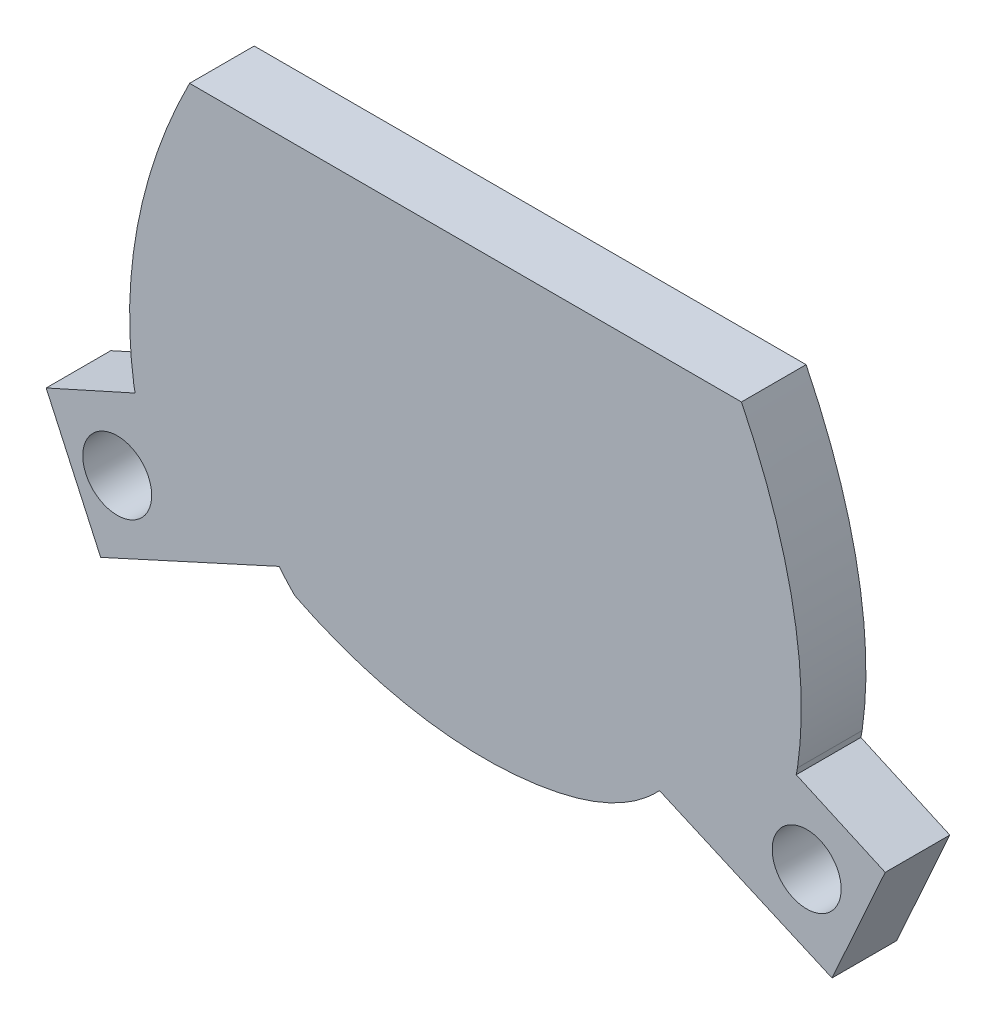
ISO-10303-21;
HEADER;
FILE_DESCRIPTION(('STEP AP214'),'2;1');
FILE_NAME('part.step','',(''),(''),'','','');
FILE_SCHEMA(('AUTOMOTIVE_DESIGN { 1 0 10303 214 1 1 1 1 }'));
ENDSEC;
DATA;
#1=APPLICATION_CONTEXT('core data for automotive mechanical design processes');
#2=APPLICATION_PROTOCOL_DEFINITION('international standard','automotive_design',2000,#1);
#3=PRODUCT_CONTEXT('',#1,'mechanical');
#4=PRODUCT('Part','Part','',(#3));
#5=PRODUCT_RELATED_PRODUCT_CATEGORY('part','',(#4));
#6=PRODUCT_DEFINITION_FORMATION('','',#4);
#7=PRODUCT_DEFINITION_CONTEXT('part definition',#1,'design');
#8=PRODUCT_DEFINITION('design','',#6,#7);
#9=PRODUCT_DEFINITION_SHAPE('','',#8);
#10=(LENGTH_UNIT() NAMED_UNIT(*) SI_UNIT(.MILLI.,.METRE.));
#11=(NAMED_UNIT(*) PLANE_ANGLE_UNIT() SI_UNIT($,.RADIAN.));
#12=(NAMED_UNIT(*) SI_UNIT($,.STERADIAN.) SOLID_ANGLE_UNIT());
#13=UNCERTAINTY_MEASURE_WITH_UNIT(LENGTH_MEASURE(1.E-05),#10,'distance_accuracy_value','');
#14=(GEOMETRIC_REPRESENTATION_CONTEXT(3) GLOBAL_UNCERTAINTY_ASSIGNED_CONTEXT((#13)) GLOBAL_UNIT_ASSIGNED_CONTEXT((#10,
#11,#12)) REPRESENTATION_CONTEXT('',''));
#15=CARTESIAN_POINT('',(0.,0.,0.));
#16=DIRECTION('',(0.,0.,1.));
#17=DIRECTION('',(1.,0.,0.));
#18=AXIS2_PLACEMENT_3D('',#15,#16,#17);
#19=CARTESIAN_POINT('',(-3.97195936555267,-4.01207544096857,-3.5));
#20=CARTESIAN_POINT('',(-2.25305588571177,-4.87339808105947,-3.5));
#21=CARTESIAN_POINT('',(0.818181256328631,-5.49697015504955,-3.5));
#22=CARTESIAN_POINT('',(3.75140915185491,-4.48949841015248,-3.5));
#23=CARTESIAN_POINT('',(4.49416265815548,-3.69907752659593,-3.5));
#24=B_SPLINE_CURVE_WITH_KNOTS('',3,(#19,#20,#21,#22,#23),.UNSPECIFIED.,.F.,.F.,(4,1,4),(0.,
0.646098760174716,1.),.UNSPECIFIED.);
#25=DIRECTION('',(0.,0.,1.));
#26=VECTOR('',#25,1.);
#27=SURFACE_OF_LINEAR_EXTRUSION('',#24,#26);
#28=CARTESIAN_POINT('',(-3.97195936555267,-4.01207544096857,-2.));
#29=CARTESIAN_POINT('',(-2.25305588571177,-4.87339808105947,-2.));
#30=CARTESIAN_POINT('',(0.818181256328631,-5.49697015504955,-2.));
#31=CARTESIAN_POINT('',(3.75140915185491,-4.48949841015248,-2.));
#32=CARTESIAN_POINT('',(4.49416265815548,-3.69907752659593,-2.));
#33=B_SPLINE_CURVE_WITH_KNOTS('',3,(#28,#29,#30,#31,#32),.UNSPECIFIED.,.F.,.F.,(4,1,4),(0.,
0.646098760174716,1.),.UNSPECIFIED.);
#34=CARTESIAN_POINT('',(-3.97195936555267,-4.01207544096857,-2.));
#35=VERTEX_POINT('',#34);
#36=CARTESIAN_POINT('',(4.49416265815548,-3.69907752659593,-2.));
#37=VERTEX_POINT('',#36);
#38=EDGE_CURVE('E163',#35,#37,#33,.T.);
#39=ORIENTED_EDGE('',*,*,#38,.F.);
#40=DIRECTION('',(0.,0.,1.));
#41=VECTOR('',#40,1.);
#42=CARTESIAN_POINT('',(-3.97195936555267,-4.01207544096857,-3.5));
#43=LINE('',#42,#41);
#44=CARTESIAN_POINT('',(-3.97195936555267,-4.01207544096857,-3.5));
#45=VERTEX_POINT('',#44);
#46=EDGE_CURVE('E11',#45,#35,#43,.T.);
#47=ORIENTED_EDGE('',*,*,#46,.F.);
#48=CARTESIAN_POINT('',(4.49416265815548,-3.69907752659593,-3.5));
#49=VERTEX_POINT('',#48);
#50=EDGE_CURVE('E243',#45,#49,#24,.T.);
#51=ORIENTED_EDGE('',*,*,#50,.T.);
#52=DIRECTION('',(0.,0.,1.));
#53=VECTOR('',#52,1.);
#54=CARTESIAN_POINT('',(4.49416265815548,-3.69907752659593,-3.5));
#55=LINE('',#54,#53);
#56=EDGE_CURVE('E36',#49,#37,#55,.T.);
#57=ORIENTED_EDGE('',*,*,#56,.T.);
#58=EDGE_LOOP('',(#39,#47,#51,#57));
#59=FACE_BOUND('',#58,.T.);
#60=ADVANCED_FACE('F32',(#59),#27,.T.);
#61=CARTESIAN_POINT('',(-4.33462623295867,-3.60616381402592,-3.5));
#62=CARTESIAN_POINT('',(-4.22005915438048,-3.74689398391151,-3.5));
#63=CARTESIAN_POINT('',(-4.09891169583794,-3.88232338201614,-3.5));
#64=CARTESIAN_POINT('',(-3.97195936555267,-4.01207544096857,-3.5));
#65=B_SPLINE_CURVE_WITH_KNOTS('',3,(#61,#62,#63,#64),.UNSPECIFIED.,.F.,.F.,(4,4),(0.,
0.126750823056757),.UNSPECIFIED.);
#66=DIRECTION('',(0.,0.,1.));
#67=VECTOR('',#66,1.);
#68=SURFACE_OF_LINEAR_EXTRUSION('',#65,#67);
#69=CARTESIAN_POINT('',(-4.33462623295867,-3.60616381402592,-2.));
#70=CARTESIAN_POINT('',(-4.22005915438048,-3.74689398391151,-2.));
#71=CARTESIAN_POINT('',(-4.09891169583794,-3.88232338201614,-2.));
#72=CARTESIAN_POINT('',(-3.97195936555267,-4.01207544096857,-2.));
#73=B_SPLINE_CURVE_WITH_KNOTS('',3,(#69,#70,#71,#72),.UNSPECIFIED.,.F.,.F.,(4,4),(0.,
0.126750823056757),.UNSPECIFIED.);
#74=CARTESIAN_POINT('',(-4.33462623295867,-3.60616381402592,-2.));
#75=VERTEX_POINT('',#74);
#76=EDGE_CURVE('E250',#75,#35,#73,.T.);
#77=ORIENTED_EDGE('',*,*,#76,.F.);
#78=DIRECTION('',(0.,0.,1.));
#79=VECTOR('',#78,1.);
#80=CARTESIAN_POINT('',(-4.33462623295867,-3.60616381402592,-3.5));
#81=LINE('',#80,#79);
#82=CARTESIAN_POINT('',(-4.33462623295867,-3.60616381402592,-3.5));
#83=VERTEX_POINT('',#82);
#84=EDGE_CURVE('E42',#83,#75,#81,.T.);
#85=ORIENTED_EDGE('',*,*,#84,.F.);
#86=EDGE_CURVE('E150',#83,#45,#65,.T.);
#87=ORIENTED_EDGE('',*,*,#86,.T.);
#88=ORIENTED_EDGE('',*,*,#46,.T.);
#89=EDGE_LOOP('',(#77,#85,#87,#88));
#90=FACE_BOUND('',#89,.T.);
#91=ADVANCED_FACE('F171',(#90),#68,.T.);
#92=CARTESIAN_POINT('',(-8.47618977931289,-5.49536875469433,-3.5));
#93=DIRECTION('',(0.415018034668083,-0.909813184615524,0.));
#94=DIRECTION('',(0.909813184615524,0.415018034668083,0.));
#95=AXIS2_PLACEMENT_3D('',#92,#93,#94);
#96=PLANE('',#95);
#97=DIRECTION('',(0.909813184615524,0.415018034668083,0.));
#98=VECTOR('',#97,1.);
#99=CARTESIAN_POINT('',(-8.47618977931289,-5.49536875469433,-2.));
#100=LINE('',#99,#98);
#101=CARTESIAN_POINT('',(-8.47618977931289,-5.49536875469433,-2.));
#102=VERTEX_POINT('',#101);
#103=EDGE_CURVE('E137',#102,#75,#100,.T.);
#104=ORIENTED_EDGE('',*,*,#103,.F.);
#105=DIRECTION('',(0.,0.,1.));
#106=VECTOR('',#105,1.);
#107=CARTESIAN_POINT('',(-8.47618977931289,-5.49536875469433,-3.5));
#108=LINE('',#107,#106);
#109=CARTESIAN_POINT('',(-8.47618977931289,-5.49536875469433,-3.5));
#110=VERTEX_POINT('',#109);
#111=EDGE_CURVE('E132',#110,#102,#108,.T.);
#112=ORIENTED_EDGE('',*,*,#111,.F.);
#113=DIRECTION('',(0.909813184615524,0.415018034668083,0.));
#114=VECTOR('',#113,1.);
#115=CARTESIAN_POINT('',(-8.47618977931289,-5.49536875469433,-3.5));
#116=LINE('',#115,#114);
#117=EDGE_CURVE('E135',#110,#83,#116,.T.);
#118=ORIENTED_EDGE('',*,*,#117,.T.);
#119=ORIENTED_EDGE('',*,*,#84,.T.);
#120=EDGE_LOOP('',(#104,#112,#118,#119));
#121=FACE_BOUND('',#120,.T.);
#122=ADVANCED_FACE('F134',(#121),#96,.T.);
#123=CARTESIAN_POINT('',(-9.74091143753534,-2.7228134838376,-3.5));
#124=DIRECTION('',(-0.909813184615524,-0.415018034668083,0.));
#125=DIRECTION('',(0.415018034668083,-0.909813184615524,0.));
#126=AXIS2_PLACEMENT_3D('',#123,#124,#125);
#127=PLANE('',#126);
#128=DIRECTION('',(0.415018034668083,-0.909813184615524,0.));
#129=VECTOR('',#128,1.);
#130=CARTESIAN_POINT('',(-9.74091143753534,-2.7228134838376,-2.));
#131=LINE('',#130,#129);
#132=CARTESIAN_POINT('',(-9.74091143753534,-2.7228134838376,-2.));
#133=VERTEX_POINT('',#132);
#134=EDGE_CURVE('E471',#133,#102,#131,.T.);
#135=ORIENTED_EDGE('',*,*,#134,.F.);
#136=DIRECTION('',(0.,0.,1.));
#137=VECTOR('',#136,1.);
#138=CARTESIAN_POINT('',(-9.74091143753534,-2.7228134838376,-3.5));
#139=LINE('',#138,#137);
#140=CARTESIAN_POINT('',(-9.74091143753534,-2.7228134838376,-3.5));
#141=VERTEX_POINT('',#140);
#142=EDGE_CURVE('E142',#141,#133,#139,.T.);
#143=ORIENTED_EDGE('',*,*,#142,.F.);
#144=DIRECTION('',(0.415018034668083,-0.909813184615524,0.));
#145=VECTOR('',#144,1.);
#146=CARTESIAN_POINT('',(-9.74091143753534,-2.7228134838376,-3.5));
#147=LINE('',#146,#145);
#148=EDGE_CURVE('E148',#141,#110,#147,.T.);
#149=ORIENTED_EDGE('',*,*,#148,.T.);
#150=ORIENTED_EDGE('',*,*,#111,.T.);
#151=EDGE_LOOP('',(#135,#143,#149,#150));
#152=FACE_BOUND('',#151,.T.);
#153=ADVANCED_FACE('F152',(#152),#127,.T.);
#154=CARTESIAN_POINT('',(-9.74091143753534,-2.7228134838376,-3.5));
#155=DIRECTION('',(-0.410622749483671,0.911805328788152,0.));
#156=DIRECTION('',(-0.911805328788153,-0.410622749483671,0.));
#157=AXIS2_PLACEMENT_3D('',#154,#155,#156);
#158=PLANE('',#157);
#159=DIRECTION('',(-0.911805328788152,-0.410622749483671,0.));
#160=VECTOR('',#159,1.);
#161=CARTESIAN_POINT('',(-9.74091143753534,-2.7228134838376,-2.));
#162=LINE('',#161,#160);
#163=CARTESIAN_POINT('',(-7.67624344077141,-1.79301013345696,-2.));
#164=VERTEX_POINT('',#163);
#165=EDGE_CURVE('E465',#164,#133,#162,.T.);
#166=ORIENTED_EDGE('',*,*,#165,.F.);
#167=DIRECTION('',(0.,0.,1.));
#168=VECTOR('',#167,1.);
#169=CARTESIAN_POINT('',(-7.67624344077141,-1.79301013345696,-3.5));
#170=LINE('',#169,#168);
#171=CARTESIAN_POINT('',(-7.67624344077141,-1.79301013345696,-3.5));
#172=VERTEX_POINT('',#171);
#173=EDGE_CURVE('E215',#172,#164,#170,.T.);
#174=ORIENTED_EDGE('',*,*,#173,.F.);
#175=DIRECTION('',(-0.911805328788152,-0.410622749483671,0.));
#176=VECTOR('',#175,1.);
#177=CARTESIAN_POINT('',(-9.74091143753534,-2.7228134838376,-3.5));
#178=LINE('',#177,#176);
#179=EDGE_CURVE('E153',#172,#141,#178,.T.);
#180=ORIENTED_EDGE('',*,*,#179,.T.);
#181=ORIENTED_EDGE('',*,*,#142,.T.);
#182=EDGE_LOOP('',(#166,#174,#180,#181));
#183=FACE_BOUND('',#182,.T.);
#184=ADVANCED_FACE('F181',(#183),#158,.T.);
#185=CARTESIAN_POINT('',(-7.70604499898786,-1.64003975939678,-3.5));
#186=DIRECTION('',(-0.981546416214704,-0.191224038279895,0.));
#187=DIRECTION('',(0.191224038279896,-0.981546416214704,0.));
#188=AXIS2_PLACEMENT_3D('',#185,#186,#187);
#189=PLANE('',#188);
#190=CARTESIAN_POINT('',(-7.70604499898786,-1.64003975939678,-2.));
#191=CARTESIAN_POINT('',(-7.67624344077141,-1.79301013345696,-2.));
#192=B_SPLINE_CURVE_WITH_KNOTS('',1,(#190,#191),.UNSPECIFIED.,.F.,.F.,(2,2),(0.,1.),.UNSPECIFIED.);
#193=CARTESIAN_POINT('',(-7.70604499898786,-1.64003975939678,-2.));
#194=VERTEX_POINT('',#193);
#195=EDGE_CURVE('E457',#194,#164,#192,.T.);
#196=ORIENTED_EDGE('',*,*,#195,.F.);
#197=DIRECTION('',(0.,0.,1.));
#198=VECTOR('',#197,1.);
#199=CARTESIAN_POINT('',(-7.70604499898786,-1.64003975939678,-3.5));
#200=LINE('',#199,#198);
#201=CARTESIAN_POINT('',(-7.70604499898786,-1.64003975939678,-3.5));
#202=VERTEX_POINT('',#201);
#203=EDGE_CURVE('E217',#202,#194,#200,.T.);
#204=ORIENTED_EDGE('',*,*,#203,.F.);
#205=CARTESIAN_POINT('',(-7.70604499898786,-1.64003975939678,-3.5));
#206=CARTESIAN_POINT('',(-7.67624344077141,-1.79301013345696,-3.5));
#207=B_SPLINE_CURVE_WITH_KNOTS('',1,(#205,#206),.UNSPECIFIED.,.F.,.F.,(2,2),(0.,1.),.UNSPECIFIED.);
#208=EDGE_CURVE('E155',#202,#172,#207,.T.);
#209=ORIENTED_EDGE('',*,*,#208,.T.);
#210=ORIENTED_EDGE('',*,*,#173,.T.);
#211=EDGE_LOOP('',(#196,#204,#209,#210));
#212=FACE_BOUND('',#211,.T.);
#213=ADVANCED_FACE('F184',(#212),#189,.T.);
#214=CARTESIAN_POINT('',(-6.41275176397359,5.06449571272047,-3.5));
#215=CARTESIAN_POINT('',(-6.79688539969621,4.31055824445773,-3.5));
#216=CARTESIAN_POINT('',(-7.67541333607806,2.14926682161049,-3.5));
#217=CARTESIAN_POINT('',(-7.92409565959741,-0.185434038460681,-3.5));
#218=CARTESIAN_POINT('',(-7.70604499898786,-1.64003975939678,-3.5));
#219=B_SPLINE_CURVE_WITH_KNOTS('',3,(#214,#215,#216,#217,#218),.UNSPECIFIED.,.F.,.F.,(4,1,4),
(0.,0.356096082715856,0.96779917640753),.UNSPECIFIED.);
#220=DIRECTION('',(0.,0.,1.));
#221=VECTOR('',#220,1.);
#222=SURFACE_OF_LINEAR_EXTRUSION('',#219,#221);
#223=CARTESIAN_POINT('',(-6.41275176397359,5.06449571272047,-2.));
#224=CARTESIAN_POINT('',(-6.79688539969621,4.31055824445773,-2.));
#225=CARTESIAN_POINT('',(-7.67541333607806,2.14926682161049,-2.));
#226=CARTESIAN_POINT('',(-7.92409565959741,-0.185434038460681,-2.));
#227=CARTESIAN_POINT('',(-7.70604499898786,-1.64003975939678,-2.));
#228=B_SPLINE_CURVE_WITH_KNOTS('',3,(#223,#224,#225,#226,#227),.UNSPECIFIED.,.F.,.F.,(4,1,4),
(0.,0.356096082715856,0.96779917640753),.UNSPECIFIED.);
#229=CARTESIAN_POINT('',(-6.41275176397358,5.06449571272047,-2.));
#230=VERTEX_POINT('',#229);
#231=EDGE_CURVE('E224',#230,#194,#228,.T.);
#232=ORIENTED_EDGE('',*,*,#231,.F.);
#233=DIRECTION('',(0.,0.,1.));
#234=VECTOR('',#233,1.);
#235=CARTESIAN_POINT('',(-6.41275176397358,5.06449571272047,-3.5));
#236=LINE('',#235,#234);
#237=CARTESIAN_POINT('',(-6.41275176397358,5.06449571272047,-3.5));
#238=VERTEX_POINT('',#237);
#239=EDGE_CURVE('E222',#238,#230,#236,.T.);
#240=ORIENTED_EDGE('',*,*,#239,.F.);
#241=EDGE_CURVE('E196',#238,#202,#219,.T.);
#242=ORIENTED_EDGE('',*,*,#241,.T.);
#243=ORIENTED_EDGE('',*,*,#203,.T.);
#244=EDGE_LOOP('',(#232,#240,#242,#243));
#245=FACE_BOUND('',#244,.T.);
#246=ADVANCED_FACE('F188',(#245),#222,.T.);
#247=CARTESIAN_POINT('',(6.3963197397993,5.06449571272047,-3.5));
#248=DIRECTION('',(0.,1.,0.));
#249=DIRECTION('',(-1.,0.,0.));
#250=AXIS2_PLACEMENT_3D('',#247,#248,#249);
#251=PLANE('',#250);
#252=DIRECTION('',(-1.,0.,0.));
#253=VECTOR('',#252,1.);
#254=CARTESIAN_POINT('',(6.3963197397993,5.06449571272047,-2.));
#255=LINE('',#254,#253);
#256=CARTESIAN_POINT('',(6.3963197397993,5.06449571272047,-2.));
#257=VERTEX_POINT('',#256);
#258=EDGE_CURVE('E433',#257,#230,#255,.T.);
#259=ORIENTED_EDGE('',*,*,#258,.F.);
#260=DIRECTION('',(0.,0.,1.));
#261=VECTOR('',#260,1.);
#262=CARTESIAN_POINT('',(6.3963197397993,5.06449571272047,-3.5));
#263=LINE('',#262,#261);
#264=CARTESIAN_POINT('',(6.3963197397993,5.06449571272047,-3.5));
#265=VERTEX_POINT('',#264);
#266=EDGE_CURVE('E228',#265,#257,#263,.T.);
#267=ORIENTED_EDGE('',*,*,#266,.F.);
#268=DIRECTION('',(-1.,0.,0.));
#269=VECTOR('',#268,1.);
#270=CARTESIAN_POINT('',(6.3963197397993,5.06449571272047,-3.5));
#271=LINE('',#270,#269);
#272=EDGE_CURVE('E202',#265,#238,#271,.T.);
#273=ORIENTED_EDGE('',*,*,#272,.T.);
#274=ORIENTED_EDGE('',*,*,#239,.T.);
#275=EDGE_LOOP('',(#259,#267,#273,#274));
#276=FACE_BOUND('',#275,.T.);
#277=ADVANCED_FACE('F193',(#276),#251,.T.);
#278=CARTESIAN_POINT('',(7.69655529924819,-1.64003975939678,-3.5));
#279=CARTESIAN_POINT('',(7.70329669249024,-1.59438898166681,-3.5));
#280=CARTESIAN_POINT('',(7.81358658517516,-0.798840627290321,-3.5));
#281=CARTESIAN_POINT('',(7.79110763235743,0.878451290883737,-3.5));
#282=CARTESIAN_POINT('',(7.26339208184155,3.09194921695741,-3.5));
#283=CARTESIAN_POINT('',(6.67795256394397,4.48895555745724,-3.5));
#284=CARTESIAN_POINT('',(6.3963197397993,5.06449571272047,-3.5));
#285=B_SPLINE_CURVE_WITH_KNOTS('',3,(#278,#279,#280,#281,#282,#283,#284),.UNSPECIFIED.,.F.,.F.,
(4,1,1,1,4),(0.0135117160783464,0.0216692364601549,0.155527703103183,0.309355131011421,
0.423527879802736),.UNSPECIFIED.);
#286=DIRECTION('',(0.,0.,1.));
#287=VECTOR('',#286,1.);
#288=SURFACE_OF_LINEAR_EXTRUSION('',#285,#287);
#289=CARTESIAN_POINT('',(7.69655529924819,-1.64003975939678,-2.));
#290=CARTESIAN_POINT('',(7.70329669249024,-1.59438898166681,-2.));
#291=CARTESIAN_POINT('',(7.81358658517516,-0.798840627290321,-2.));
#292=CARTESIAN_POINT('',(7.79110763235743,0.878451290883737,-2.));
#293=CARTESIAN_POINT('',(7.26339208184155,3.09194921695741,-2.));
#294=CARTESIAN_POINT('',(6.67795256394397,4.48895555745724,-2.));
#295=CARTESIAN_POINT('',(6.3963197397993,5.06449571272047,-2.));
#296=B_SPLINE_CURVE_WITH_KNOTS('',3,(#289,#290,#291,#292,#293,#294,#295),.UNSPECIFIED.,.F.,.F.,
(4,1,1,1,4),(0.0135117160783464,0.0216692364601549,0.155527703103183,0.309355131011421,
0.423527879802736),.UNSPECIFIED.);
#297=CARTESIAN_POINT('',(7.6965552992482,-1.64003975939678,-2.));
#298=VERTEX_POINT('',#297);
#299=EDGE_CURVE('E435',#298,#257,#296,.T.);
#300=ORIENTED_EDGE('',*,*,#299,.F.);
#301=DIRECTION('',(0.,0.,1.));
#302=VECTOR('',#301,1.);
#303=CARTESIAN_POINT('',(7.6965552992482,-1.64003975939678,-3.5));
#304=LINE('',#303,#302);
#305=CARTESIAN_POINT('',(7.6965552992482,-1.64003975939678,-3.5));
#306=VERTEX_POINT('',#305);
#307=EDGE_CURVE('E231',#306,#298,#304,.T.);
#308=ORIENTED_EDGE('',*,*,#307,.F.);
#309=EDGE_CURVE('E282',#306,#265,#285,.T.);
#310=ORIENTED_EDGE('',*,*,#309,.T.);
#311=ORIENTED_EDGE('',*,*,#266,.T.);
#312=EDGE_LOOP('',(#300,#308,#310,#311));
#313=FACE_BOUND('',#312,.T.);
#314=ADVANCED_FACE('F293',(#313),#288,.T.);
#315=CARTESIAN_POINT('',(7.66761644252443,-1.79301013345696,-3.5));
#316=DIRECTION('',(0.982571987086092,-0.18588246338396,0.));
#317=DIRECTION('',(0.18588246338396,0.982571987086092,0.));
#318=AXIS2_PLACEMENT_3D('',#315,#316,#317);
#319=PLANE('',#318);
#320=CARTESIAN_POINT('',(7.66761644252443,-1.79301013345696,-2.));
#321=CARTESIAN_POINT('',(7.6965552992482,-1.64003975939678,-2.));
#322=B_SPLINE_CURVE_WITH_KNOTS('',1,(#320,#321),.UNSPECIFIED.,.F.,.F.,(2,2),(0.,1.),.UNSPECIFIED.);
#323=CARTESIAN_POINT('',(7.66761644252443,-1.79301013345696,-2.));
#324=VERTEX_POINT('',#323);
#325=EDGE_CURVE('E441',#324,#298,#322,.T.);
#326=ORIENTED_EDGE('',*,*,#325,.F.);
#327=DIRECTION('',(0.,0.,1.));
#328=VECTOR('',#327,1.);
#329=CARTESIAN_POINT('',(7.66761644252443,-1.79301013345696,-3.5));
#330=LINE('',#329,#328);
#331=CARTESIAN_POINT('',(7.66761644252443,-1.79301013345696,-3.5));
#332=VERTEX_POINT('',#331);
#333=EDGE_CURVE('E236',#332,#324,#330,.T.);
#334=ORIENTED_EDGE('',*,*,#333,.F.);
#335=CARTESIAN_POINT('',(7.66761644252443,-1.79301013345696,-3.5));
#336=CARTESIAN_POINT('',(7.6965552992482,-1.64003975939678,-3.5));
#337=B_SPLINE_CURVE_WITH_KNOTS('',1,(#335,#336),.UNSPECIFIED.,.F.,.F.,(2,2),(0.,1.),.UNSPECIFIED.);
#338=EDGE_CURVE('E278',#332,#306,#337,.T.);
#339=ORIENTED_EDGE('',*,*,#338,.T.);
#340=ORIENTED_EDGE('',*,*,#307,.T.);
#341=EDGE_LOOP('',(#326,#334,#339,#340));
#342=FACE_BOUND('',#341,.T.);
#343=ADVANCED_FACE('F296',(#342),#319,.T.);
#344=CARTESIAN_POINT('',(9.73228444023592,-2.72281348424525,-3.5));
#345=DIRECTION('',(0.410622749476667,0.911805328791306,0.));
#346=DIRECTION('',(-0.911805328791306,0.410622749476667,0.));
#347=AXIS2_PLACEMENT_3D('',#344,#345,#346);
#348=PLANE('',#347);
#349=DIRECTION('',(-0.911805328791306,0.410622749476667,0.));
#350=VECTOR('',#349,1.);
#351=CARTESIAN_POINT('',(9.73228444023592,-2.72281348424525,-2.));
#352=LINE('',#351,#350);
#353=CARTESIAN_POINT('',(9.73228444023592,-2.72281348424525,-2.));
#354=VERTEX_POINT('',#353);
#355=EDGE_CURVE('E443',#354,#324,#352,.T.);
#356=ORIENTED_EDGE('',*,*,#355,.F.);
#357=DIRECTION('',(0.,0.,1.));
#358=VECTOR('',#357,1.);
#359=CARTESIAN_POINT('',(9.73228444023592,-2.72281348424525,-3.5));
#360=LINE('',#359,#358);
#361=CARTESIAN_POINT('',(9.73228444023592,-2.72281348424525,-3.5));
#362=VERTEX_POINT('',#361);
#363=EDGE_CURVE('E238',#362,#354,#360,.T.);
#364=ORIENTED_EDGE('',*,*,#363,.F.);
#365=DIRECTION('',(-0.911805328791306,0.410622749476667,0.));
#366=VECTOR('',#365,1.);
#367=CARTESIAN_POINT('',(9.73228444023592,-2.72281348424525,-3.5));
#368=LINE('',#367,#366);
#369=EDGE_CURVE('E275',#362,#332,#368,.T.);
#370=ORIENTED_EDGE('',*,*,#369,.T.);
#371=ORIENTED_EDGE('',*,*,#333,.T.);
#372=EDGE_LOOP('',(#356,#364,#370,#371));
#373=FACE_BOUND('',#372,.T.);
#374=ADVANCED_FACE('F300',(#373),#348,.T.);
#375=CARTESIAN_POINT('',(8.49835182450298,-5.4628134862632,-3.5));
#376=DIRECTION('',(0.911805328791306,-0.410622749476667,0.));
#377=DIRECTION('',(0.410622749476667,0.911805328791306,0.));
#378=AXIS2_PLACEMENT_3D('',#375,#376,#377);
#379=PLANE('',#378);
#380=DIRECTION('',(0.410622749476667,0.911805328791306,0.));
#381=VECTOR('',#380,1.);
#382=CARTESIAN_POINT('',(8.49835182450298,-5.4628134862632,-2.));
#383=LINE('',#382,#381);
#384=CARTESIAN_POINT('',(8.49835182450298,-5.4628134862632,-2.));
#385=VERTEX_POINT('',#384);
#386=EDGE_CURVE('E249',#385,#354,#383,.T.);
#387=ORIENTED_EDGE('',*,*,#386,.F.);
#388=DIRECTION('',(0.,0.,1.));
#389=VECTOR('',#388,1.);
#390=CARTESIAN_POINT('',(8.49835182450298,-5.4628134862632,-3.5));
#391=LINE('',#390,#389);
#392=CARTESIAN_POINT('',(8.49835182450298,-5.4628134862632,-3.5));
#393=VERTEX_POINT('',#392);
#394=EDGE_CURVE('E239',#393,#385,#391,.T.);
#395=ORIENTED_EDGE('',*,*,#394,.F.);
#396=DIRECTION('',(0.410622749476667,0.911805328791306,0.));
#397=VECTOR('',#396,1.);
#398=CARTESIAN_POINT('',(8.49835182450298,-5.4628134862632,-3.5));
#399=LINE('',#398,#397);
#400=EDGE_CURVE('E272',#393,#362,#399,.T.);
#401=ORIENTED_EDGE('',*,*,#400,.T.);
#402=ORIENTED_EDGE('',*,*,#363,.T.);
#403=EDGE_LOOP('',(#387,#395,#401,#402));
#404=FACE_BOUND('',#403,.T.);
#405=ADVANCED_FACE('F304',(#404),#379,.T.);
#406=CARTESIAN_POINT('',(8.49835182450298,-5.4628134862632,-3.5));
#407=DIRECTION('',(-0.403101000357226,-0.915155496902577,0.));
#408=DIRECTION('',(0.915155496902578,-0.403101000357226,0.));
#409=AXIS2_PLACEMENT_3D('',#406,#407,#408);
#410=PLANE('',#409);
#411=DIRECTION('',(0.915155496902577,-0.403101000357226,0.));
#412=VECTOR('',#411,1.);
#413=CARTESIAN_POINT('',(8.49835182450298,-5.4628134862632,-2.));
#414=LINE('',#413,#412);
#415=EDGE_CURVE('E245',#37,#385,#414,.T.);
#416=ORIENTED_EDGE('',*,*,#415,.F.);
#417=ORIENTED_EDGE('',*,*,#56,.F.);
#418=DIRECTION('',(0.915155496902577,-0.403101000357226,0.));
#419=VECTOR('',#418,1.);
#420=CARTESIAN_POINT('',(8.49835182450298,-5.4628134862632,-3.5));
#421=LINE('',#420,#419);
#422=EDGE_CURVE('E267',#49,#393,#421,.T.);
#423=ORIENTED_EDGE('',*,*,#422,.T.);
#424=ORIENTED_EDGE('',*,*,#394,.T.);
#425=EDGE_LOOP('',(#416,#417,#423,#424));
#426=FACE_BOUND('',#425,.T.);
#427=ADVANCED_FACE('F246',(#426),#410,.T.);
#428=CARTESIAN_POINT('',(0.345845668870529,-5.08501030717487,-3.5));
#429=DIRECTION('',(0.,0.,1.));
#430=DIRECTION('',(1.,0.,0.));
#431=AXIS2_PLACEMENT_3D('',#428,#429,#430);
#432=PLANE('',#431);
#433=CARTESIAN_POINT('',(7.90988892656028,-3.56988276056654,-3.5));
#434=DIRECTION('',(0.,0.,1.));
#435=DIRECTION('',(1.,0.,0.));
#436=AXIS2_PLACEMENT_3D('',#433,#434,#435);
#437=CIRCLE('',#436,0.800000000000001);
#438=CARTESIAN_POINT('',(8.70988892656028,-3.56988276056654,-3.5));
#439=VERTEX_POINT('',#438);
#440=EDGE_CURVE('E258',#439,#439,#437,.T.);
#441=ORIENTED_EDGE('',*,*,#440,.T.);
#442=EDGE_LOOP('',(#441));
#443=FACE_BOUND('',#442,.T.);
#444=CARTESIAN_POINT('',(-8.09179803217941,-3.65795928688926,-3.5));
#445=DIRECTION('',(0.,0.,1.));
#446=DIRECTION('',(1.,0.,0.));
#447=AXIS2_PLACEMENT_3D('',#444,#445,#446);
#448=CIRCLE('',#447,0.800000000000001);
#449=CARTESIAN_POINT('',(-7.29179803217941,-3.65795928688926,-3.5));
#450=VERTEX_POINT('',#449);
#451=EDGE_CURVE('E251',#450,#450,#448,.T.);
#452=ORIENTED_EDGE('',*,*,#451,.T.);
#453=EDGE_LOOP('',(#452));
#454=FACE_BOUND('',#453,.T.);
#455=ORIENTED_EDGE('',*,*,#50,.F.);
#456=ORIENTED_EDGE('',*,*,#86,.F.);
#457=ORIENTED_EDGE('',*,*,#117,.F.);
#458=ORIENTED_EDGE('',*,*,#148,.F.);
#459=ORIENTED_EDGE('',*,*,#179,.F.);
#460=ORIENTED_EDGE('',*,*,#208,.F.);
#461=ORIENTED_EDGE('',*,*,#241,.F.);
#462=ORIENTED_EDGE('',*,*,#272,.F.);
#463=ORIENTED_EDGE('',*,*,#309,.F.);
#464=ORIENTED_EDGE('',*,*,#338,.F.);
#465=ORIENTED_EDGE('',*,*,#369,.F.);
#466=ORIENTED_EDGE('',*,*,#400,.F.);
#467=ORIENTED_EDGE('',*,*,#422,.F.);
#468=EDGE_LOOP('',(#455,#456,#457,#458,#459,#460,#461,#462,#463,#464,#465,#466,#467));
#469=FACE_BOUND('',#468,.T.);
#470=ADVANCED_FACE('F146',(#443,#454,#469),#432,.F.);
#471=CARTESIAN_POINT('',(0.345845668870529,-5.08501030717487,-2.));
#472=DIRECTION('',(0.,0.,1.));
#473=DIRECTION('',(1.,0.,0.));
#474=AXIS2_PLACEMENT_3D('',#471,#472,#473);
#475=PLANE('',#474);
#476=CARTESIAN_POINT('',(7.90988892656028,-3.56988276056654,-2.));
#477=DIRECTION('',(0.,0.,1.));
#478=DIRECTION('',(1.,0.,0.));
#479=AXIS2_PLACEMENT_3D('',#476,#477,#478);
#480=CIRCLE('',#479,0.800000000000001);
#481=CARTESIAN_POINT('',(8.70988892656028,-3.56988276056654,-2.));
#482=VERTEX_POINT('',#481);
#483=EDGE_CURVE('E261',#482,#482,#480,.T.);
#484=ORIENTED_EDGE('',*,*,#483,.F.);
#485=EDGE_LOOP('',(#484));
#486=FACE_BOUND('',#485,.T.);
#487=CARTESIAN_POINT('',(-8.09179803217941,-3.65795928688926,-2.));
#488=DIRECTION('',(0.,0.,1.));
#489=DIRECTION('',(1.,0.,0.));
#490=AXIS2_PLACEMENT_3D('',#487,#488,#489);
#491=CIRCLE('',#490,0.800000000000001);
#492=CARTESIAN_POINT('',(-7.29179803217941,-3.65795928688926,-2.));
#493=VERTEX_POINT('',#492);
#494=EDGE_CURVE('E253',#493,#493,#491,.T.);
#495=ORIENTED_EDGE('',*,*,#494,.F.);
#496=EDGE_LOOP('',(#495));
#497=FACE_BOUND('',#496,.T.);
#498=ORIENTED_EDGE('',*,*,#38,.T.);
#499=ORIENTED_EDGE('',*,*,#415,.T.);
#500=ORIENTED_EDGE('',*,*,#386,.T.);
#501=ORIENTED_EDGE('',*,*,#355,.T.);
#502=ORIENTED_EDGE('',*,*,#325,.T.);
#503=ORIENTED_EDGE('',*,*,#299,.T.);
#504=ORIENTED_EDGE('',*,*,#258,.T.);
#505=ORIENTED_EDGE('',*,*,#231,.T.);
#506=ORIENTED_EDGE('',*,*,#195,.T.);
#507=ORIENTED_EDGE('',*,*,#165,.T.);
#508=ORIENTED_EDGE('',*,*,#134,.T.);
#509=ORIENTED_EDGE('',*,*,#103,.T.);
#510=ORIENTED_EDGE('',*,*,#76,.T.);
#511=EDGE_LOOP('',(#498,#499,#500,#501,#502,#503,#504,#505,#506,#507,#508,#509,#510));
#512=FACE_BOUND('',#511,.T.);
#513=ADVANCED_FACE('F175',(#486,#497,#512),#475,.T.);
#514=CARTESIAN_POINT('',(-8.09179803217941,-3.65795928688926,-3.5));
#515=DIRECTION('',(0.,0.,1.));
#516=DIRECTION('',(1.,0.,0.));
#517=AXIS2_PLACEMENT_3D('',#514,#515,#516);
#518=CYLINDRICAL_SURFACE('',#517,0.800000000000001);
#519=ORIENTED_EDGE('',*,*,#451,.F.);
#520=EDGE_LOOP('',(#519));
#521=FACE_BOUND('',#520,.T.);
#522=ORIENTED_EDGE('',*,*,#494,.T.);
#523=EDGE_LOOP('',(#522));
#524=FACE_BOUND('',#523,.T.);
#525=ADVANCED_FACE('F380',(#521,#524),#518,.F.);
#526=CARTESIAN_POINT('',(7.90988892656028,-3.56988276056654,-3.5));
#527=DIRECTION('',(0.,0.,1.));
#528=DIRECTION('',(1.,0.,0.));
#529=AXIS2_PLACEMENT_3D('',#526,#527,#528);
#530=CYLINDRICAL_SURFACE('',#529,0.800000000000001);
#531=ORIENTED_EDGE('',*,*,#440,.F.);
#532=EDGE_LOOP('',(#531));
#533=FACE_BOUND('',#532,.T.);
#534=ORIENTED_EDGE('',*,*,#483,.T.);
#535=EDGE_LOOP('',(#534));
#536=FACE_BOUND('',#535,.T.);
#537=ADVANCED_FACE('F389',(#533,#536),#530,.F.);
#538=CLOSED_SHELL('',(#60,#91,#122,#153,#184,#213,#246,#277,#314,#343,#374,#405,#427,#470,#513,
#525,#537));
#539=MANIFOLD_SOLID_BREP('B2',#538);
#540=ADVANCED_BREP_SHAPE_REPRESENTATION('',(#18,#539),#14);
#541=SHAPE_DEFINITION_REPRESENTATION(#9,#540);
ENDSEC;
END-ISO-10303-21;
